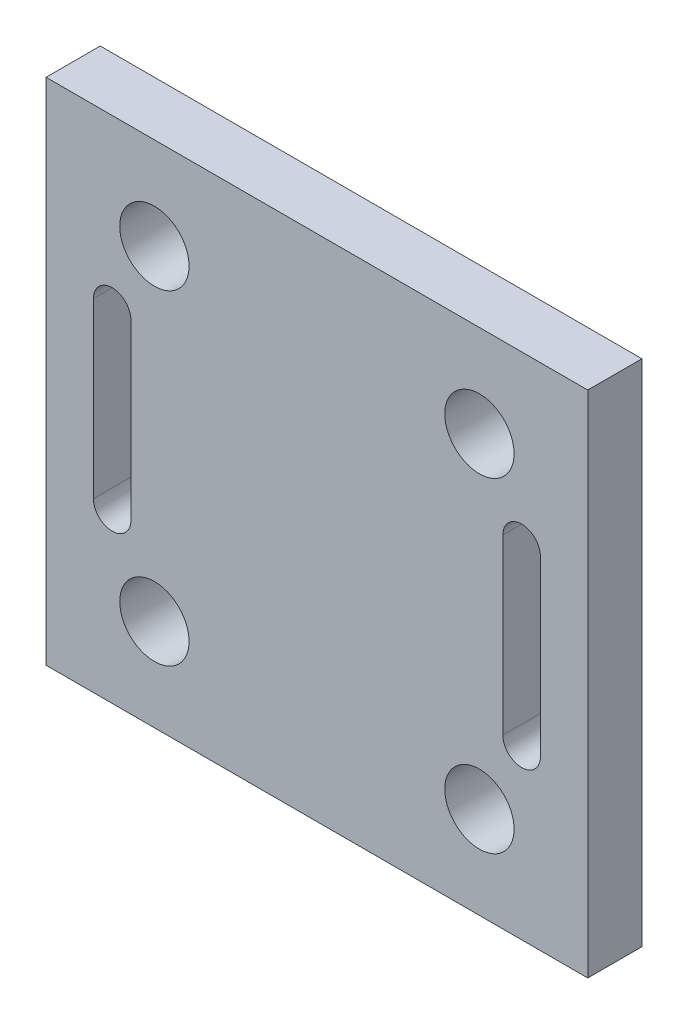
ISO-10303-21;
HEADER;
FILE_DESCRIPTION(('STEP AP214'),'2;1');
FILE_NAME('part.step','',(''),(''),'','','');
FILE_SCHEMA(('AUTOMOTIVE_DESIGN { 1 0 10303 214 1 1 1 1 }'));
ENDSEC;
DATA;
#1=APPLICATION_CONTEXT('core data for automotive mechanical design processes');
#2=APPLICATION_PROTOCOL_DEFINITION('international standard','automotive_design',2000,#1);
#3=PRODUCT_CONTEXT('',#1,'mechanical');
#4=PRODUCT('Part','Part','',(#3));
#5=PRODUCT_RELATED_PRODUCT_CATEGORY('part','',(#4));
#6=PRODUCT_DEFINITION_FORMATION('','',#4);
#7=PRODUCT_DEFINITION_CONTEXT('part definition',#1,'design');
#8=PRODUCT_DEFINITION('design','',#6,#7);
#9=PRODUCT_DEFINITION_SHAPE('','',#8);
#10=(LENGTH_UNIT() NAMED_UNIT(*) SI_UNIT(.MILLI.,.METRE.));
#11=(NAMED_UNIT(*) PLANE_ANGLE_UNIT() SI_UNIT($,.RADIAN.));
#12=(NAMED_UNIT(*) SI_UNIT($,.STERADIAN.) SOLID_ANGLE_UNIT());
#13=UNCERTAINTY_MEASURE_WITH_UNIT(LENGTH_MEASURE(1.E-05),#10,'distance_accuracy_value','');
#14=(GEOMETRIC_REPRESENTATION_CONTEXT(3) GLOBAL_UNCERTAINTY_ASSIGNED_CONTEXT((#13)) GLOBAL_UNIT_ASSIGNED_CONTEXT((#10,
#11,#12)) REPRESENTATION_CONTEXT('',''));
#15=CARTESIAN_POINT('',(0.,0.,0.));
#16=DIRECTION('',(0.,0.,1.));
#17=DIRECTION('',(1.,0.,0.));
#18=AXIS2_PLACEMENT_3D('',#15,#16,#17);
#19=CARTESIAN_POINT('',(26.775,0.,3.175));
#20=DIRECTION('',(-1.,0.,0.));
#21=DIRECTION('',(0.,-1.,0.));
#22=AXIS2_PLACEMENT_3D('',#19,#20,#21);
#23=PLANE('',#22);
#24=DIRECTION('',(0.,1.,0.));
#25=VECTOR('',#24,1.);
#26=CARTESIAN_POINT('',(26.775,0.,0.));
#27=LINE('',#26,#25);
#28=CARTESIAN_POINT('',(26.775,9.84250000000001,0.));
#29=VERTEX_POINT('',#28);
#30=CARTESIAN_POINT('',(26.775,20.0025,0.));
#31=VERTEX_POINT('',#30);
#32=EDGE_CURVE('E197',#29,#31,#27,.T.);
#33=ORIENTED_EDGE('',*,*,#32,.T.);
#34=DIRECTION('',(0.,0.,-1.));
#35=VECTOR('',#34,1.);
#36=CARTESIAN_POINT('',(26.775,20.0025,3.175));
#37=LINE('',#36,#35);
#38=CARTESIAN_POINT('',(26.775,20.0025,3.175));
#39=VERTEX_POINT('',#38);
#40=EDGE_CURVE('E11',#39,#31,#37,.T.);
#41=ORIENTED_EDGE('',*,*,#40,.F.);
#42=DIRECTION('',(0.,1.,0.));
#43=VECTOR('',#42,1.);
#44=CARTESIAN_POINT('',(26.775,0.,3.175));
#45=LINE('',#44,#43);
#46=CARTESIAN_POINT('',(26.775,9.84250000000001,3.175));
#47=VERTEX_POINT('',#46);
#48=EDGE_CURVE('E143',#47,#39,#45,.T.);
#49=ORIENTED_EDGE('',*,*,#48,.F.);
#50=DIRECTION('',(0.,0.,-1.));
#51=VECTOR('',#50,1.);
#52=CARTESIAN_POINT('',(26.775,9.84250000000001,3.175));
#53=LINE('',#52,#51);
#54=EDGE_CURVE('E209',#47,#29,#53,.T.);
#55=ORIENTED_EDGE('',*,*,#54,.T.);
#56=EDGE_LOOP('',(#33,#41,#49,#55));
#57=FACE_BOUND('',#56,.T.);
#58=ADVANCED_FACE('F41',(#57),#23,.F.);
#59=CARTESIAN_POINT('',(27.875,20.0025,3.175));
#60=DIRECTION('',(0.,0.,-1.));
#61=DIRECTION('',(-1.,0.,0.));
#62=AXIS2_PLACEMENT_3D('',#59,#60,#61);
#63=CYLINDRICAL_SURFACE('',#62,1.10000000000001);
#64=CARTESIAN_POINT('',(27.875,20.0025,0.));
#65=DIRECTION('',(0.,0.,1.));
#66=DIRECTION('',(1.,0.,0.));
#67=AXIS2_PLACEMENT_3D('',#64,#65,#66);
#68=CIRCLE('',#67,1.10000000000001);
#69=CARTESIAN_POINT('',(28.975,20.0025,0.));
#70=VERTEX_POINT('',#69);
#71=EDGE_CURVE('E150',#31,#70,#68,.F.);
#72=ORIENTED_EDGE('',*,*,#71,.T.);
#73=DIRECTION('',(0.,0.,-1.));
#74=VECTOR('',#73,1.);
#75=CARTESIAN_POINT('',(28.975,20.0025,3.175));
#76=LINE('',#75,#74);
#77=CARTESIAN_POINT('',(28.975,20.0025,3.175));
#78=VERTEX_POINT('',#77);
#79=EDGE_CURVE('E52',#78,#70,#76,.T.);
#80=ORIENTED_EDGE('',*,*,#79,.F.);
#81=CARTESIAN_POINT('',(27.875,20.0025,3.175));
#82=DIRECTION('',(0.,0.,1.));
#83=DIRECTION('',(1.,0.,0.));
#84=AXIS2_PLACEMENT_3D('',#81,#82,#83);
#85=CIRCLE('',#84,1.10000000000001);
#86=EDGE_CURVE('E137',#39,#78,#85,.F.);
#87=ORIENTED_EDGE('',*,*,#86,.F.);
#88=ORIENTED_EDGE('',*,*,#40,.T.);
#89=EDGE_LOOP('',(#72,#80,#87,#88));
#90=FACE_BOUND('',#89,.T.);
#91=ADVANCED_FACE('F149',(#90),#63,.F.);
#92=CARTESIAN_POINT('',(28.975,0.,3.175));
#93=DIRECTION('',(-1.,0.,0.));
#94=DIRECTION('',(0.,-1.,0.));
#95=AXIS2_PLACEMENT_3D('',#92,#93,#94);
#96=PLANE('',#95);
#97=DIRECTION('',(0.,1.,0.));
#98=VECTOR('',#97,1.);
#99=CARTESIAN_POINT('',(28.975,0.,0.));
#100=LINE('',#99,#98);
#101=CARTESIAN_POINT('',(28.975,9.84250000000001,0.));
#102=VERTEX_POINT('',#101);
#103=EDGE_CURVE('E203',#102,#70,#100,.T.);
#104=ORIENTED_EDGE('',*,*,#103,.F.);
#105=DIRECTION('',(0.,0.,-1.));
#106=VECTOR('',#105,1.);
#107=CARTESIAN_POINT('',(28.975,9.84250000000001,3.175));
#108=LINE('',#107,#106);
#109=CARTESIAN_POINT('',(28.975,9.84250000000001,3.175));
#110=VERTEX_POINT('',#109);
#111=EDGE_CURVE('E101',#110,#102,#108,.T.);
#112=ORIENTED_EDGE('',*,*,#111,.F.);
#113=DIRECTION('',(0.,1.,0.));
#114=VECTOR('',#113,1.);
#115=CARTESIAN_POINT('',(28.975,0.,3.175));
#116=LINE('',#115,#114);
#117=EDGE_CURVE('E141',#110,#78,#116,.T.);
#118=ORIENTED_EDGE('',*,*,#117,.T.);
#119=ORIENTED_EDGE('',*,*,#79,.T.);
#120=EDGE_LOOP('',(#104,#112,#118,#119));
#121=FACE_BOUND('',#120,.T.);
#122=ADVANCED_FACE('F156',(#121),#96,.T.);
#123=CARTESIAN_POINT('',(0.,0.,3.175));
#124=DIRECTION('',(0.,1.,0.));
#125=DIRECTION('',(0.,0.,1.));
#126=AXIS2_PLACEMENT_3D('',#123,#124,#125);
#127=PLANE('',#126);
#128=DIRECTION('',(1.,0.,0.));
#129=VECTOR('',#128,1.);
#130=CARTESIAN_POINT('',(0.,0.,0.));
#131=LINE('',#130,#129);
#132=CARTESIAN_POINT('',(0.,0.,0.));
#133=VERTEX_POINT('',#132);
#134=CARTESIAN_POINT('',(31.75,0.,0.));
#135=VERTEX_POINT('',#134);
#136=EDGE_CURVE('E181',#133,#135,#131,.T.);
#137=ORIENTED_EDGE('',*,*,#136,.T.);
#138=DIRECTION('',(0.,0.,-1.));
#139=VECTOR('',#138,1.);
#140=CARTESIAN_POINT('',(31.75,0.,3.175));
#141=LINE('',#140,#139);
#142=CARTESIAN_POINT('',(31.75,0.,3.175));
#143=VERTEX_POINT('',#142);
#144=EDGE_CURVE('E212',#143,#135,#141,.T.);
#145=ORIENTED_EDGE('',*,*,#144,.F.);
#146=DIRECTION('',(1.,0.,0.));
#147=VECTOR('',#146,1.);
#148=CARTESIAN_POINT('',(0.,0.,3.175));
#149=LINE('',#148,#147);
#150=CARTESIAN_POINT('',(0.,0.,3.175));
#151=VERTEX_POINT('',#150);
#152=EDGE_CURVE('E257',#151,#143,#149,.T.);
#153=ORIENTED_EDGE('',*,*,#152,.F.);
#154=DIRECTION('',(0.,0.,-1.));
#155=VECTOR('',#154,1.);
#156=CARTESIAN_POINT('',(0.,0.,3.175));
#157=LINE('',#156,#155);
#158=EDGE_CURVE('E215',#151,#133,#157,.T.);
#159=ORIENTED_EDGE('',*,*,#158,.T.);
#160=EDGE_LOOP('',(#137,#145,#153,#159));
#161=FACE_BOUND('',#160,.T.);
#162=ADVANCED_FACE('F294',(#161),#127,.F.);
#163=CARTESIAN_POINT('',(31.75,0.,3.175));
#164=DIRECTION('',(-1.,0.,0.));
#165=DIRECTION('',(0.,0.,1.));
#166=AXIS2_PLACEMENT_3D('',#163,#164,#165);
#167=PLANE('',#166);
#168=DIRECTION('',(0.,1.,0.));
#169=VECTOR('',#168,1.);
#170=CARTESIAN_POINT('',(31.75,0.,0.));
#171=LINE('',#170,#169);
#172=CARTESIAN_POINT('',(31.75,29.845,0.));
#173=VERTEX_POINT('',#172);
#174=EDGE_CURVE('E185',#135,#173,#171,.T.);
#175=ORIENTED_EDGE('',*,*,#174,.T.);
#176=DIRECTION('',(0.,0.,-1.));
#177=VECTOR('',#176,1.);
#178=CARTESIAN_POINT('',(31.75,29.845,3.175));
#179=LINE('',#178,#177);
#180=CARTESIAN_POINT('',(31.75,29.845,3.175));
#181=VERTEX_POINT('',#180);
#182=EDGE_CURVE('E221',#181,#173,#179,.T.);
#183=ORIENTED_EDGE('',*,*,#182,.F.);
#184=DIRECTION('',(0.,1.,0.));
#185=VECTOR('',#184,1.);
#186=CARTESIAN_POINT('',(31.75,0.,3.175));
#187=LINE('',#186,#185);
#188=EDGE_CURVE('E269',#143,#181,#187,.T.);
#189=ORIENTED_EDGE('',*,*,#188,.F.);
#190=ORIENTED_EDGE('',*,*,#144,.T.);
#191=EDGE_LOOP('',(#175,#183,#189,#190));
#192=FACE_BOUND('',#191,.T.);
#193=ADVANCED_FACE('F296',(#192),#167,.F.);
#194=CARTESIAN_POINT('',(0.,29.845,3.175));
#195=DIRECTION('',(0.,1.,0.));
#196=DIRECTION('',(0.,0.,1.));
#197=AXIS2_PLACEMENT_3D('',#194,#195,#196);
#198=PLANE('',#197);
#199=DIRECTION('',(1.,0.,0.));
#200=VECTOR('',#199,1.);
#201=CARTESIAN_POINT('',(0.,29.845,0.));
#202=LINE('',#201,#200);
#203=CARTESIAN_POINT('',(0.,29.845,0.));
#204=VERTEX_POINT('',#203);
#205=EDGE_CURVE('E189',#204,#173,#202,.T.);
#206=ORIENTED_EDGE('',*,*,#205,.F.);
#207=DIRECTION('',(0.,0.,-1.));
#208=VECTOR('',#207,1.);
#209=CARTESIAN_POINT('',(0.,29.845,3.175));
#210=LINE('',#209,#208);
#211=CARTESIAN_POINT('',(0.,29.845,3.175));
#212=VERTEX_POINT('',#211);
#213=EDGE_CURVE('E218',#212,#204,#210,.T.);
#214=ORIENTED_EDGE('',*,*,#213,.F.);
#215=DIRECTION('',(1.,0.,0.));
#216=VECTOR('',#215,1.);
#217=CARTESIAN_POINT('',(0.,29.845,3.175));
#218=LINE('',#217,#216);
#219=EDGE_CURVE('E272',#212,#181,#218,.T.);
#220=ORIENTED_EDGE('',*,*,#219,.T.);
#221=ORIENTED_EDGE('',*,*,#182,.T.);
#222=EDGE_LOOP('',(#206,#214,#220,#221));
#223=FACE_BOUND('',#222,.T.);
#224=ADVANCED_FACE('F290',(#223),#198,.T.);
#225=CARTESIAN_POINT('',(3.875,20.0025,3.175));
#226=DIRECTION('',(0.,0.,-1.));
#227=DIRECTION('',(-1.,0.,0.));
#228=AXIS2_PLACEMENT_3D('',#225,#226,#227);
#229=CYLINDRICAL_SURFACE('',#228,1.10000000000001);
#230=CARTESIAN_POINT('',(3.875,20.0025,0.));
#231=DIRECTION('',(0.,0.,1.));
#232=DIRECTION('',(1.,0.,0.));
#233=AXIS2_PLACEMENT_3D('',#230,#231,#232);
#234=CIRCLE('',#233,1.10000000000001);
#235=CARTESIAN_POINT('',(4.97500000000001,20.0025,0.));
#236=VERTEX_POINT('',#235);
#237=CARTESIAN_POINT('',(2.77499999999999,20.0025,0.));
#238=VERTEX_POINT('',#237);
#239=EDGE_CURVE('E164',#236,#238,#234,.T.);
#240=ORIENTED_EDGE('',*,*,#239,.F.);
#241=DIRECTION('',(0.,0.,-1.));
#242=VECTOR('',#241,1.);
#243=CARTESIAN_POINT('',(4.97500000000001,20.0025,3.175));
#244=LINE('',#243,#242);
#245=CARTESIAN_POINT('',(4.97500000000001,20.0025,3.175));
#246=VERTEX_POINT('',#245);
#247=EDGE_CURVE('E45',#246,#236,#244,.T.);
#248=ORIENTED_EDGE('',*,*,#247,.F.);
#249=CARTESIAN_POINT('',(3.875,20.0025,3.175));
#250=DIRECTION('',(0.,0.,1.));
#251=DIRECTION('',(1.,0.,0.));
#252=AXIS2_PLACEMENT_3D('',#249,#250,#251);
#253=CIRCLE('',#252,1.10000000000001);
#254=CARTESIAN_POINT('',(2.77499999999999,20.0025,3.175));
#255=VERTEX_POINT('',#254);
#256=EDGE_CURVE('E208',#246,#255,#253,.T.);
#257=ORIENTED_EDGE('',*,*,#256,.T.);
#258=DIRECTION('',(0.,0.,-1.));
#259=VECTOR('',#258,1.);
#260=CARTESIAN_POINT('',(2.77499999999999,20.0025,3.175));
#261=LINE('',#260,#259);
#262=EDGE_CURVE('E160',#255,#238,#261,.T.);
#263=ORIENTED_EDGE('',*,*,#262,.T.);
#264=EDGE_LOOP('',(#240,#248,#257,#263));
#265=FACE_BOUND('',#264,.T.);
#266=ADVANCED_FACE('F43',(#265),#229,.F.);
#267=CARTESIAN_POINT('',(4.97500000000001,0.,3.175));
#268=DIRECTION('',(-1.,0.,0.));
#269=DIRECTION('',(0.,-1.,0.));
#270=AXIS2_PLACEMENT_3D('',#267,#268,#269);
#271=PLANE('',#270);
#272=DIRECTION('',(0.,1.,0.));
#273=VECTOR('',#272,1.);
#274=CARTESIAN_POINT('',(4.97500000000001,0.,0.));
#275=LINE('',#274,#273);
#276=CARTESIAN_POINT('',(4.97500000000001,9.84250000000001,0.));
#277=VERTEX_POINT('',#276);
#278=EDGE_CURVE('E168',#277,#236,#275,.T.);
#279=ORIENTED_EDGE('',*,*,#278,.F.);
#280=DIRECTION('',(0.,0.,-1.));
#281=VECTOR('',#280,1.);
#282=CARTESIAN_POINT('',(4.97500000000001,9.84250000000001,3.175));
#283=LINE('',#282,#281);
#284=CARTESIAN_POINT('',(4.97500000000001,9.84250000000001,3.175));
#285=VERTEX_POINT('',#284);
#286=EDGE_CURVE('E231',#285,#277,#283,.T.);
#287=ORIENTED_EDGE('',*,*,#286,.F.);
#288=DIRECTION('',(0.,1.,0.));
#289=VECTOR('',#288,1.);
#290=CARTESIAN_POINT('',(4.97500000000001,0.,3.175));
#291=LINE('',#290,#289);
#292=EDGE_CURVE('E242',#285,#246,#291,.T.);
#293=ORIENTED_EDGE('',*,*,#292,.T.);
#294=ORIENTED_EDGE('',*,*,#247,.T.);
#295=EDGE_LOOP('',(#279,#287,#293,#294));
#296=FACE_BOUND('',#295,.T.);
#297=ADVANCED_FACE('F240',(#296),#271,.T.);
#298=CARTESIAN_POINT('',(3.875,9.8425,3.175));
#299=DIRECTION('',(0.,0.,-1.));
#300=DIRECTION('',(-1.,0.,0.));
#301=AXIS2_PLACEMENT_3D('',#298,#299,#300);
#302=CYLINDRICAL_SURFACE('',#301,1.10000000000001);
#303=CARTESIAN_POINT('',(3.875,9.8425,0.));
#304=DIRECTION('',(0.,0.,1.));
#305=DIRECTION('',(1.,0.,0.));
#306=AXIS2_PLACEMENT_3D('',#303,#304,#305);
#307=CIRCLE('',#306,1.10000000000001);
#308=CARTESIAN_POINT('',(2.77499999999999,9.8425,0.));
#309=VERTEX_POINT('',#308);
#310=EDGE_CURVE('E173',#309,#277,#307,.T.);
#311=ORIENTED_EDGE('',*,*,#310,.F.);
#312=DIRECTION('',(0.,0.,-1.));
#313=VECTOR('',#312,1.);
#314=CARTESIAN_POINT('',(2.77499999999999,9.8425,3.175));
#315=LINE('',#314,#313);
#316=CARTESIAN_POINT('',(2.77499999999999,9.8425,3.175));
#317=VERTEX_POINT('',#316);
#318=EDGE_CURVE('E229',#317,#309,#315,.T.);
#319=ORIENTED_EDGE('',*,*,#318,.F.);
#320=CARTESIAN_POINT('',(3.875,9.8425,3.175));
#321=DIRECTION('',(0.,0.,1.));
#322=DIRECTION('',(1.,0.,0.));
#323=AXIS2_PLACEMENT_3D('',#320,#321,#322);
#324=CIRCLE('',#323,1.10000000000001);
#325=EDGE_CURVE('E251',#317,#285,#324,.T.);
#326=ORIENTED_EDGE('',*,*,#325,.T.);
#327=ORIENTED_EDGE('',*,*,#286,.T.);
#328=EDGE_LOOP('',(#311,#319,#326,#327));
#329=FACE_BOUND('',#328,.T.);
#330=ADVANCED_FACE('F248',(#329),#302,.F.);
#331=CARTESIAN_POINT('',(0.,0.,3.175));
#332=DIRECTION('',(-1.,0.,0.));
#333=DIRECTION('',(0.,0.,1.));
#334=AXIS2_PLACEMENT_3D('',#331,#332,#333);
#335=PLANE('',#334);
#336=DIRECTION('',(0.,1.,0.));
#337=VECTOR('',#336,1.);
#338=CARTESIAN_POINT('',(0.,0.,0.));
#339=LINE('',#338,#337);
#340=EDGE_CURVE('E193',#133,#204,#339,.T.);
#341=ORIENTED_EDGE('',*,*,#340,.F.);
#342=ORIENTED_EDGE('',*,*,#158,.F.);
#343=DIRECTION('',(0.,1.,0.));
#344=VECTOR('',#343,1.);
#345=CARTESIAN_POINT('',(0.,0.,3.175));
#346=LINE('',#345,#344);
#347=EDGE_CURVE('E276',#151,#212,#346,.T.);
#348=ORIENTED_EDGE('',*,*,#347,.T.);
#349=ORIENTED_EDGE('',*,*,#213,.T.);
#350=EDGE_LOOP('',(#341,#342,#348,#349));
#351=FACE_BOUND('',#350,.T.);
#352=ADVANCED_FACE('F283',(#351),#335,.T.);
#353=CARTESIAN_POINT('',(2.775,0.,3.175));
#354=DIRECTION('',(-1.,0.,0.));
#355=DIRECTION('',(0.,-1.,0.));
#356=AXIS2_PLACEMENT_3D('',#353,#354,#355);
#357=PLANE('',#356);
#358=DIRECTION('',(0.,1.,0.));
#359=VECTOR('',#358,1.);
#360=CARTESIAN_POINT('',(2.775,0.,0.));
#361=LINE('',#360,#359);
#362=EDGE_CURVE('E177',#309,#238,#361,.T.);
#363=ORIENTED_EDGE('',*,*,#362,.T.);
#364=ORIENTED_EDGE('',*,*,#262,.F.);
#365=DIRECTION('',(0.,1.,0.));
#366=VECTOR('',#365,1.);
#367=CARTESIAN_POINT('',(2.775,0.,3.175));
#368=LINE('',#367,#366);
#369=EDGE_CURVE('E253',#317,#255,#368,.T.);
#370=ORIENTED_EDGE('',*,*,#369,.F.);
#371=ORIENTED_EDGE('',*,*,#318,.T.);
#372=EDGE_LOOP('',(#363,#364,#370,#371));
#373=FACE_BOUND('',#372,.T.);
#374=ADVANCED_FACE('F254',(#373),#357,.F.);
#375=CARTESIAN_POINT('',(27.875,9.84250000000001,3.175));
#376=DIRECTION('',(0.,0.,-1.));
#377=DIRECTION('',(-1.,0.,0.));
#378=AXIS2_PLACEMENT_3D('',#375,#376,#377);
#379=CYLINDRICAL_SURFACE('',#378,1.10000000000001);
#380=CARTESIAN_POINT('',(27.875,9.84250000000001,0.));
#381=DIRECTION('',(0.,0.,1.));
#382=DIRECTION('',(1.,0.,0.));
#383=AXIS2_PLACEMENT_3D('',#380,#381,#382);
#384=CIRCLE('',#383,1.10000000000001);
#385=EDGE_CURVE('E104',#102,#29,#384,.F.);
#386=ORIENTED_EDGE('',*,*,#385,.T.);
#387=ORIENTED_EDGE('',*,*,#54,.F.);
#388=CARTESIAN_POINT('',(27.875,9.84250000000001,3.175));
#389=DIRECTION('',(0.,0.,1.));
#390=DIRECTION('',(1.,0.,0.));
#391=AXIS2_PLACEMENT_3D('',#388,#389,#390);
#392=CIRCLE('',#391,1.10000000000001);
#393=EDGE_CURVE('E61',#110,#47,#392,.F.);
#394=ORIENTED_EDGE('',*,*,#393,.F.);
#395=ORIENTED_EDGE('',*,*,#111,.T.);
#396=EDGE_LOOP('',(#386,#387,#394,#395));
#397=FACE_BOUND('',#396,.T.);
#398=ADVANCED_FACE('F319',(#397),#379,.F.);
#399=CARTESIAN_POINT('',(0.,0.,3.175));
#400=DIRECTION('',(0.,0.,1.));
#401=DIRECTION('',(1.,0.,0.));
#402=AXIS2_PLACEMENT_3D('',#399,#400,#401);
#403=PLANE('',#402);
#404=CARTESIAN_POINT('',(25.4,24.4475,3.175));
#405=DIRECTION('',(0.,0.,-1.));
#406=DIRECTION('',(-1.,0.,0.));
#407=AXIS2_PLACEMENT_3D('',#404,#405,#406);
#408=CIRCLE('',#407,2.032);
#409=CARTESIAN_POINT('',(23.368,24.4475,3.175));
#410=VERTEX_POINT('',#409);
#411=EDGE_CURVE('E394',#410,#410,#408,.T.);
#412=ORIENTED_EDGE('',*,*,#411,.T.);
#413=EDGE_LOOP('',(#412));
#414=FACE_BOUND('',#413,.T.);
#415=CARTESIAN_POINT('',(6.35,24.4475,3.175));
#416=DIRECTION('',(0.,0.,-1.));
#417=DIRECTION('',(-1.,0.,0.));
#418=AXIS2_PLACEMENT_3D('',#415,#416,#417);
#419=CIRCLE('',#418,2.032);
#420=CARTESIAN_POINT('',(4.318,24.4475,3.175));
#421=VERTEX_POINT('',#420);
#422=EDGE_CURVE('E407',#421,#421,#419,.T.);
#423=ORIENTED_EDGE('',*,*,#422,.T.);
#424=EDGE_LOOP('',(#423));
#425=FACE_BOUND('',#424,.T.);
#426=CARTESIAN_POINT('',(6.35,5.3975,3.175));
#427=DIRECTION('',(0.,0.,-1.));
#428=DIRECTION('',(-1.,0.,0.));
#429=AXIS2_PLACEMENT_3D('',#426,#427,#428);
#430=CIRCLE('',#429,2.032);
#431=CARTESIAN_POINT('',(4.318,5.3975,3.175));
#432=VERTEX_POINT('',#431);
#433=EDGE_CURVE('E415',#432,#432,#430,.T.);
#434=ORIENTED_EDGE('',*,*,#433,.T.);
#435=EDGE_LOOP('',(#434));
#436=FACE_BOUND('',#435,.T.);
#437=CARTESIAN_POINT('',(25.4,5.3975,3.175));
#438=DIRECTION('',(0.,0.,-1.));
#439=DIRECTION('',(-1.,0.,0.));
#440=AXIS2_PLACEMENT_3D('',#437,#438,#439);
#441=CIRCLE('',#440,2.032);
#442=CARTESIAN_POINT('',(23.368,5.3975,3.175));
#443=VERTEX_POINT('',#442);
#444=EDGE_CURVE('E169',#443,#443,#441,.T.);
#445=ORIENTED_EDGE('',*,*,#444,.T.);
#446=EDGE_LOOP('',(#445));
#447=FACE_BOUND('',#446,.T.);
#448=ORIENTED_EDGE('',*,*,#256,.F.);
#449=ORIENTED_EDGE('',*,*,#292,.F.);
#450=ORIENTED_EDGE('',*,*,#325,.F.);
#451=ORIENTED_EDGE('',*,*,#369,.T.);
#452=EDGE_LOOP('',(#448,#449,#450,#451));
#453=FACE_BOUND('',#452,.T.);
#454=ORIENTED_EDGE('',*,*,#152,.T.);
#455=ORIENTED_EDGE('',*,*,#188,.T.);
#456=ORIENTED_EDGE('',*,*,#219,.F.);
#457=ORIENTED_EDGE('',*,*,#347,.F.);
#458=EDGE_LOOP('',(#454,#455,#456,#457));
#459=FACE_BOUND('',#458,.T.);
#460=ORIENTED_EDGE('',*,*,#48,.T.);
#461=ORIENTED_EDGE('',*,*,#86,.T.);
#462=ORIENTED_EDGE('',*,*,#117,.F.);
#463=ORIENTED_EDGE('',*,*,#393,.T.);
#464=EDGE_LOOP('',(#460,#461,#462,#463));
#465=FACE_BOUND('',#464,.T.);
#466=ADVANCED_FACE('F139',(#414,#425,#436,#447,#453,#459,#465),#403,.T.);
#467=CARTESIAN_POINT('',(0.,0.,0.));
#468=DIRECTION('',(0.,0.,1.));
#469=DIRECTION('',(1.,0.,0.));
#470=AXIS2_PLACEMENT_3D('',#467,#468,#469);
#471=PLANE('',#470);
#472=CARTESIAN_POINT('',(25.4,24.4475,0.));
#473=DIRECTION('',(0.,0.,-1.));
#474=DIRECTION('',(-1.,0.,0.));
#475=AXIS2_PLACEMENT_3D('',#472,#473,#474);
#476=CIRCLE('',#475,2.032);
#477=CARTESIAN_POINT('',(23.368,24.4475,0.));
#478=VERTEX_POINT('',#477);
#479=EDGE_CURVE('E397',#478,#478,#476,.T.);
#480=ORIENTED_EDGE('',*,*,#479,.F.);
#481=EDGE_LOOP('',(#480));
#482=FACE_BOUND('',#481,.T.);
#483=CARTESIAN_POINT('',(6.35,24.4475,0.));
#484=DIRECTION('',(0.,0.,-1.));
#485=DIRECTION('',(-1.,0.,0.));
#486=AXIS2_PLACEMENT_3D('',#483,#484,#485);
#487=CIRCLE('',#486,2.032);
#488=CARTESIAN_POINT('',(4.318,24.4475,0.));
#489=VERTEX_POINT('',#488);
#490=EDGE_CURVE('E401',#489,#489,#487,.T.);
#491=ORIENTED_EDGE('',*,*,#490,.F.);
#492=EDGE_LOOP('',(#491));
#493=FACE_BOUND('',#492,.T.);
#494=CARTESIAN_POINT('',(6.35,5.3975,0.));
#495=DIRECTION('',(0.,0.,-1.));
#496=DIRECTION('',(-1.,0.,0.));
#497=AXIS2_PLACEMENT_3D('',#494,#495,#496);
#498=CIRCLE('',#497,2.032);
#499=CARTESIAN_POINT('',(4.318,5.3975,0.));
#500=VERTEX_POINT('',#499);
#501=EDGE_CURVE('E411',#500,#500,#498,.T.);
#502=ORIENTED_EDGE('',*,*,#501,.F.);
#503=EDGE_LOOP('',(#502));
#504=FACE_BOUND('',#503,.T.);
#505=CARTESIAN_POINT('',(25.4,5.3975,0.));
#506=DIRECTION('',(0.,0.,-1.));
#507=DIRECTION('',(-1.,0.,0.));
#508=AXIS2_PLACEMENT_3D('',#505,#506,#507);
#509=CIRCLE('',#508,2.032);
#510=CARTESIAN_POINT('',(23.368,5.3975,0.));
#511=VERTEX_POINT('',#510);
#512=EDGE_CURVE('E419',#511,#511,#509,.T.);
#513=ORIENTED_EDGE('',*,*,#512,.F.);
#514=EDGE_LOOP('',(#513));
#515=FACE_BOUND('',#514,.T.);
#516=ORIENTED_EDGE('',*,*,#239,.T.);
#517=ORIENTED_EDGE('',*,*,#362,.F.);
#518=ORIENTED_EDGE('',*,*,#310,.T.);
#519=ORIENTED_EDGE('',*,*,#278,.T.);
#520=EDGE_LOOP('',(#516,#517,#518,#519));
#521=FACE_BOUND('',#520,.T.);
#522=ORIENTED_EDGE('',*,*,#136,.F.);
#523=ORIENTED_EDGE('',*,*,#340,.T.);
#524=ORIENTED_EDGE('',*,*,#205,.T.);
#525=ORIENTED_EDGE('',*,*,#174,.F.);
#526=EDGE_LOOP('',(#522,#523,#524,#525));
#527=FACE_BOUND('',#526,.T.);
#528=ORIENTED_EDGE('',*,*,#32,.F.);
#529=ORIENTED_EDGE('',*,*,#385,.F.);
#530=ORIENTED_EDGE('',*,*,#103,.T.);
#531=ORIENTED_EDGE('',*,*,#71,.F.);
#532=EDGE_LOOP('',(#528,#529,#530,#531));
#533=FACE_BOUND('',#532,.T.);
#534=ADVANCED_FACE('F246',(#482,#493,#504,#515,#521,#527,#533),#471,.F.);
#535=CARTESIAN_POINT('',(25.4,5.3975,0.));
#536=DIRECTION('',(0.,0.,-1.));
#537=DIRECTION('',(-1.,0.,0.));
#538=AXIS2_PLACEMENT_3D('',#535,#536,#537);
#539=CYLINDRICAL_SURFACE('',#538,2.032);
#540=ORIENTED_EDGE('',*,*,#444,.F.);
#541=EDGE_LOOP('',(#540));
#542=FACE_BOUND('',#541,.T.);
#543=ORIENTED_EDGE('',*,*,#512,.T.);
#544=EDGE_LOOP('',(#543));
#545=FACE_BOUND('',#544,.T.);
#546=ADVANCED_FACE('F370',(#542,#545),#539,.F.);
#547=CARTESIAN_POINT('',(6.35,5.3975,0.));
#548=DIRECTION('',(0.,0.,-1.));
#549=DIRECTION('',(-1.,0.,0.));
#550=AXIS2_PLACEMENT_3D('',#547,#548,#549);
#551=CYLINDRICAL_SURFACE('',#550,2.032);
#552=ORIENTED_EDGE('',*,*,#433,.F.);
#553=EDGE_LOOP('',(#552));
#554=FACE_BOUND('',#553,.T.);
#555=ORIENTED_EDGE('',*,*,#501,.T.);
#556=EDGE_LOOP('',(#555));
#557=FACE_BOUND('',#556,.T.);
#558=ADVANCED_FACE('F377',(#554,#557),#551,.F.);
#559=CARTESIAN_POINT('',(6.35,24.4475,0.));
#560=DIRECTION('',(0.,0.,-1.));
#561=DIRECTION('',(-1.,0.,0.));
#562=AXIS2_PLACEMENT_3D('',#559,#560,#561);
#563=CYLINDRICAL_SURFACE('',#562,2.032);
#564=ORIENTED_EDGE('',*,*,#422,.F.);
#565=EDGE_LOOP('',(#564));
#566=FACE_BOUND('',#565,.T.);
#567=ORIENTED_EDGE('',*,*,#490,.T.);
#568=EDGE_LOOP('',(#567));
#569=FACE_BOUND('',#568,.T.);
#570=ADVANCED_FACE('F381',(#566,#569),#563,.F.);
#571=CARTESIAN_POINT('',(25.4,24.4475,0.));
#572=DIRECTION('',(0.,0.,-1.));
#573=DIRECTION('',(-1.,0.,0.));
#574=AXIS2_PLACEMENT_3D('',#571,#572,#573);
#575=CYLINDRICAL_SURFACE('',#574,2.032);
#576=ORIENTED_EDGE('',*,*,#411,.F.);
#577=EDGE_LOOP('',(#576));
#578=FACE_BOUND('',#577,.T.);
#579=ORIENTED_EDGE('',*,*,#479,.T.);
#580=EDGE_LOOP('',(#579));
#581=FACE_BOUND('',#580,.T.);
#582=ADVANCED_FACE('F385',(#578,#581),#575,.F.);
#583=CLOSED_SHELL('',(#58,#91,#122,#162,#193,#224,#266,#297,#330,#352,#374,#398,#466,#534,#546,
#558,#570,#582));
#584=MANIFOLD_SOLID_BREP('B2',#583);
#585=ADVANCED_BREP_SHAPE_REPRESENTATION('',(#18,#584),#14);
#586=SHAPE_DEFINITION_REPRESENTATION(#9,#585);
ENDSEC;
END-ISO-10303-21;
